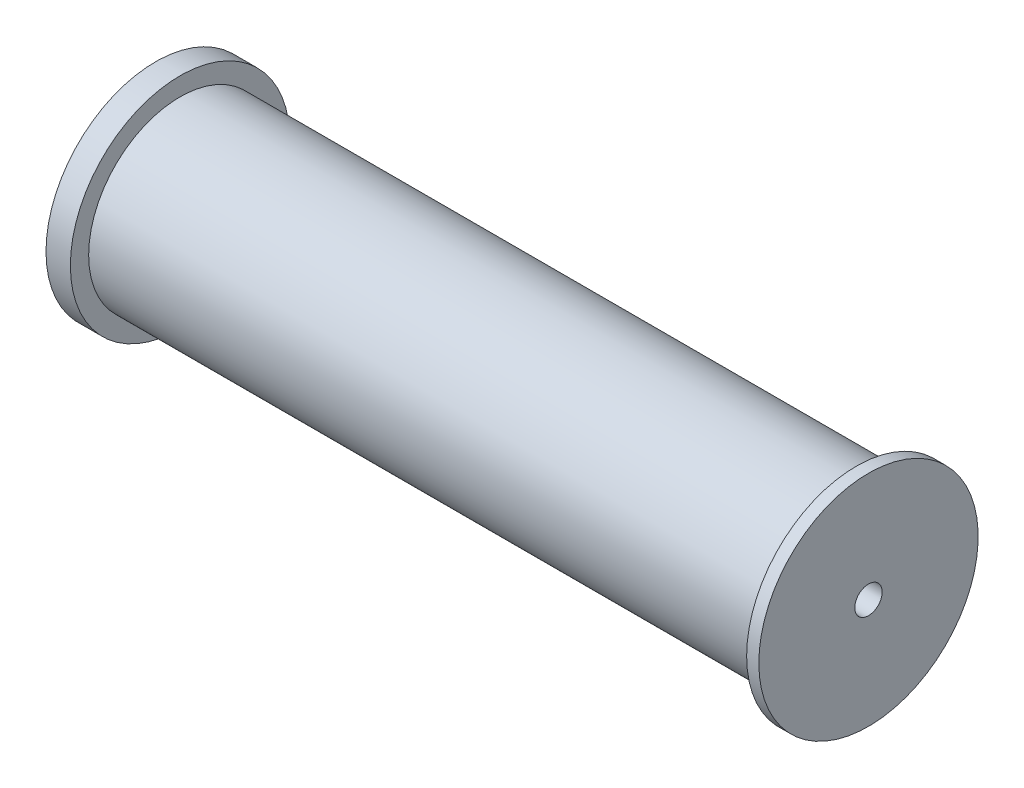
ISO-10303-21;
HEADER;
FILE_DESCRIPTION(('STEP AP214'),'2;1');
FILE_NAME('part.step','',(''),(''),'','','');
FILE_SCHEMA(('AUTOMOTIVE_DESIGN { 1 0 10303 214 1 1 1 1 }'));
ENDSEC;
DATA;
#1=APPLICATION_CONTEXT('core data for automotive mechanical design processes');
#2=APPLICATION_PROTOCOL_DEFINITION('international standard','automotive_design',2000,#1);
#3=PRODUCT_CONTEXT('',#1,'mechanical');
#4=PRODUCT('Part','Part','',(#3));
#5=PRODUCT_RELATED_PRODUCT_CATEGORY('part','',(#4));
#6=PRODUCT_DEFINITION_FORMATION('','',#4);
#7=PRODUCT_DEFINITION_CONTEXT('part definition',#1,'design');
#8=PRODUCT_DEFINITION('design','',#6,#7);
#9=PRODUCT_DEFINITION_SHAPE('','',#8);
#10=(LENGTH_UNIT() NAMED_UNIT(*) SI_UNIT(.MILLI.,.METRE.));
#11=(NAMED_UNIT(*) PLANE_ANGLE_UNIT() SI_UNIT($,.RADIAN.));
#12=(NAMED_UNIT(*) SI_UNIT($,.STERADIAN.) SOLID_ANGLE_UNIT());
#13=UNCERTAINTY_MEASURE_WITH_UNIT(LENGTH_MEASURE(1.E-05),#10,'distance_accuracy_value','');
#14=(GEOMETRIC_REPRESENTATION_CONTEXT(3) GLOBAL_UNCERTAINTY_ASSIGNED_CONTEXT((#13)) GLOBAL_UNIT_ASSIGNED_CONTEXT((#10,
#11,#12)) REPRESENTATION_CONTEXT('',''));
#15=CARTESIAN_POINT('',(0.,0.,0.));
#16=DIRECTION('',(0.,0.,1.));
#17=DIRECTION('',(1.,0.,0.));
#18=AXIS2_PLACEMENT_3D('',#15,#16,#17);
#19=CARTESIAN_POINT('',(117.,18.,0.));
#20=DIRECTION('',(-1.,0.,0.));
#21=DIRECTION('',(0.,0.,1.));
#22=AXIS2_PLACEMENT_3D('',#19,#20,#21);
#23=PLANE('',#22);
#24=CARTESIAN_POINT('',(117.,0.,0.));
#25=DIRECTION('',(-1.,0.,0.));
#26=DIRECTION('',(0.,0.,1.));
#27=AXIS2_PLACEMENT_3D('',#24,#25,#26);
#28=CIRCLE('',#27,2.25);
#29=CARTESIAN_POINT('',(117.,0.,2.25));
#30=VERTEX_POINT('',#29);
#31=EDGE_CURVE('E56',#30,#30,#28,.T.);
#32=ORIENTED_EDGE('',*,*,#31,.T.);
#33=EDGE_LOOP('',(#32));
#34=FACE_BOUND('',#33,.T.);
#35=CARTESIAN_POINT('',(117.,0.,0.));
#36=DIRECTION('',(-1.,0.,0.));
#37=DIRECTION('',(0.,0.,1.));
#38=AXIS2_PLACEMENT_3D('',#35,#36,#37);
#39=CIRCLE('',#38,18.);
#40=CARTESIAN_POINT('',(117.,0.,18.));
#41=VERTEX_POINT('',#40);
#42=EDGE_CURVE('E10',#41,#41,#39,.T.);
#43=ORIENTED_EDGE('',*,*,#42,.F.);
#44=EDGE_LOOP('',(#43));
#45=FACE_BOUND('',#44,.T.);
#46=ADVANCED_FACE('F31',(#34,#45),#23,.F.);
#47=CARTESIAN_POINT('',(-23.4382800704961,0.,0.));
#48=DIRECTION('',(-1.,0.,0.));
#49=DIRECTION('',(0.,0.,1.));
#50=AXIS2_PLACEMENT_3D('',#47,#48,#49);
#51=CYLINDRICAL_SURFACE('',#50,18.);
#52=CARTESIAN_POINT('',(115.,0.,0.));
#53=DIRECTION('',(-1.,0.,0.));
#54=DIRECTION('',(0.,0.,1.));
#55=AXIS2_PLACEMENT_3D('',#52,#53,#54);
#56=CIRCLE('',#55,18.);
#57=CARTESIAN_POINT('',(115.,0.,18.));
#58=VERTEX_POINT('',#57);
#59=EDGE_CURVE('E37',#58,#58,#56,.T.);
#60=ORIENTED_EDGE('',*,*,#59,.F.);
#61=EDGE_LOOP('',(#60));
#62=FACE_BOUND('',#61,.T.);
#63=ORIENTED_EDGE('',*,*,#42,.T.);
#64=EDGE_LOOP('',(#63));
#65=FACE_BOUND('',#64,.T.);
#66=ADVANCED_FACE('F97',(#62,#65),#51,.T.);
#67=CARTESIAN_POINT('',(115.,15.,0.));
#68=DIRECTION('',(1.,0.,0.));
#69=DIRECTION('',(0.,0.,-1.));
#70=AXIS2_PLACEMENT_3D('',#67,#68,#69);
#71=PLANE('',#70);
#72=CARTESIAN_POINT('',(115.,0.,0.));
#73=DIRECTION('',(-1.,0.,0.));
#74=DIRECTION('',(0.,0.,1.));
#75=AXIS2_PLACEMENT_3D('',#72,#73,#74);
#76=CIRCLE('',#75,15.);
#77=CARTESIAN_POINT('',(115.,0.,15.));
#78=VERTEX_POINT('',#77);
#79=EDGE_CURVE('E41',#78,#78,#76,.T.);
#80=ORIENTED_EDGE('',*,*,#79,.F.);
#81=EDGE_LOOP('',(#80));
#82=FACE_BOUND('',#81,.T.);
#83=ORIENTED_EDGE('',*,*,#59,.T.);
#84=EDGE_LOOP('',(#83));
#85=FACE_BOUND('',#84,.T.);
#86=ADVANCED_FACE('F92',(#82,#85),#71,.F.);
#87=CARTESIAN_POINT('',(-23.4382800704961,0.,0.));
#88=DIRECTION('',(-1.,0.,0.));
#89=DIRECTION('',(0.,0.,1.));
#90=AXIS2_PLACEMENT_3D('',#87,#88,#89);
#91=CYLINDRICAL_SURFACE('',#90,15.);
#92=CARTESIAN_POINT('',(4.,0.,0.));
#93=DIRECTION('',(-1.,0.,0.));
#94=DIRECTION('',(0.,0.,1.));
#95=AXIS2_PLACEMENT_3D('',#92,#93,#94);
#96=CIRCLE('',#95,15.);
#97=CARTESIAN_POINT('',(4.,0.,15.));
#98=VERTEX_POINT('',#97);
#99=EDGE_CURVE('E45',#98,#98,#96,.T.);
#100=ORIENTED_EDGE('',*,*,#99,.F.);
#101=EDGE_LOOP('',(#100));
#102=FACE_BOUND('',#101,.T.);
#103=ORIENTED_EDGE('',*,*,#79,.T.);
#104=EDGE_LOOP('',(#103));
#105=FACE_BOUND('',#104,.T.);
#106=ADVANCED_FACE('F86',(#102,#105),#91,.T.);
#107=CARTESIAN_POINT('',(4.,18.,0.));
#108=DIRECTION('',(-1.,0.,0.));
#109=DIRECTION('',(0.,0.,1.));
#110=AXIS2_PLACEMENT_3D('',#107,#108,#109);
#111=PLANE('',#110);
#112=CARTESIAN_POINT('',(4.,0.,0.));
#113=DIRECTION('',(-1.,0.,0.));
#114=DIRECTION('',(0.,0.,1.));
#115=AXIS2_PLACEMENT_3D('',#112,#113,#114);
#116=CIRCLE('',#115,18.);
#117=CARTESIAN_POINT('',(4.,0.,18.));
#118=VERTEX_POINT('',#117);
#119=EDGE_CURVE('E50',#118,#118,#116,.T.);
#120=ORIENTED_EDGE('',*,*,#119,.F.);
#121=EDGE_LOOP('',(#120));
#122=FACE_BOUND('',#121,.T.);
#123=ORIENTED_EDGE('',*,*,#99,.T.);
#124=EDGE_LOOP('',(#123));
#125=FACE_BOUND('',#124,.T.);
#126=ADVANCED_FACE('F80',(#122,#125),#111,.F.);
#127=CARTESIAN_POINT('',(-23.4382800704961,0.,0.));
#128=DIRECTION('',(-1.,0.,0.));
#129=DIRECTION('',(0.,0.,1.));
#130=AXIS2_PLACEMENT_3D('',#127,#128,#129);
#131=CYLINDRICAL_SURFACE('',#130,18.);
#132=CARTESIAN_POINT('',(0.,0.,0.));
#133=DIRECTION('',(-1.,0.,0.));
#134=DIRECTION('',(0.,0.,1.));
#135=AXIS2_PLACEMENT_3D('',#132,#133,#134);
#136=CIRCLE('',#135,18.);
#137=CARTESIAN_POINT('',(0.,0.,18.));
#138=VERTEX_POINT('',#137);
#139=EDGE_CURVE('E53',#138,#138,#136,.T.);
#140=ORIENTED_EDGE('',*,*,#139,.F.);
#141=EDGE_LOOP('',(#140));
#142=FACE_BOUND('',#141,.T.);
#143=ORIENTED_EDGE('',*,*,#119,.T.);
#144=EDGE_LOOP('',(#143));
#145=FACE_BOUND('',#144,.T.);
#146=ADVANCED_FACE('F74',(#142,#145),#131,.T.);
#147=CARTESIAN_POINT('',(0.,18.,0.));
#148=DIRECTION('',(1.,0.,0.));
#149=DIRECTION('',(0.,0.,-1.));
#150=AXIS2_PLACEMENT_3D('',#147,#148,#149);
#151=PLANE('',#150);
#152=CARTESIAN_POINT('',(0.,0.,0.));
#153=DIRECTION('',(-1.,0.,0.));
#154=DIRECTION('',(0.,0.,1.));
#155=AXIS2_PLACEMENT_3D('',#152,#153,#154);
#156=CIRCLE('',#155,2.25);
#157=CARTESIAN_POINT('',(0.,0.,2.25));
#158=VERTEX_POINT('',#157);
#159=EDGE_CURVE('E57',#158,#158,#156,.T.);
#160=ORIENTED_EDGE('',*,*,#159,.F.);
#161=EDGE_LOOP('',(#160));
#162=FACE_BOUND('',#161,.T.);
#163=ORIENTED_EDGE('',*,*,#139,.T.);
#164=EDGE_LOOP('',(#163));
#165=FACE_BOUND('',#164,.T.);
#166=ADVANCED_FACE('F68',(#162,#165),#151,.F.);
#167=CARTESIAN_POINT('',(117.,0.,0.));
#168=DIRECTION('',(-1.,0.,0.));
#169=DIRECTION('',(0.,0.,1.));
#170=AXIS2_PLACEMENT_3D('',#167,#168,#169);
#171=CYLINDRICAL_SURFACE('',#170,2.25);
#172=ORIENTED_EDGE('',*,*,#31,.F.);
#173=EDGE_LOOP('',(#172));
#174=FACE_BOUND('',#173,.T.);
#175=ORIENTED_EDGE('',*,*,#159,.T.);
#176=EDGE_LOOP('',(#175));
#177=FACE_BOUND('',#176,.T.);
#178=ADVANCED_FACE('F65',(#174,#177),#171,.F.);
#179=CLOSED_SHELL('',(#46,#66,#86,#106,#126,#146,#166,#178));
#180=MANIFOLD_SOLID_BREP('B2',#179);
#181=ADVANCED_BREP_SHAPE_REPRESENTATION('',(#18,#180),#14);
#182=SHAPE_DEFINITION_REPRESENTATION(#9,#181);
ENDSEC;
END-ISO-10303-21;
